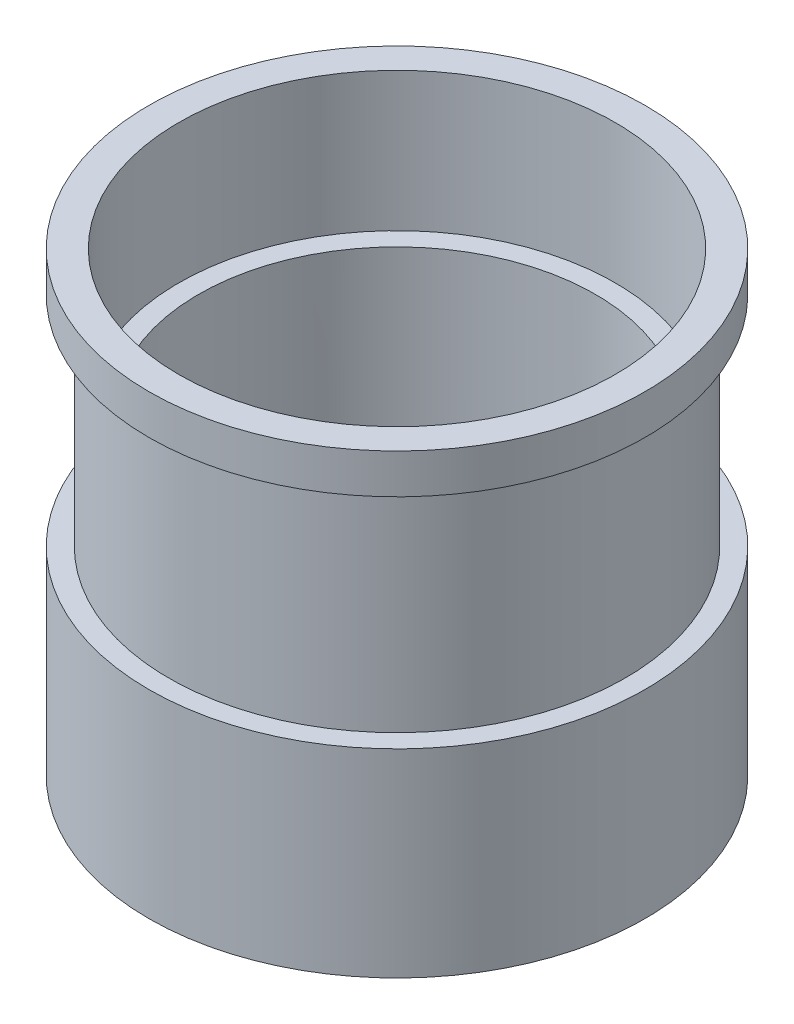
ISO-10303-21;
HEADER;
FILE_DESCRIPTION(('STEP AP214'),'2;1');
FILE_NAME('part.step','',(''),(''),'','','');
FILE_SCHEMA(('AUTOMOTIVE_DESIGN { 1 0 10303 214 1 1 1 1 }'));
ENDSEC;
DATA;
#1=APPLICATION_CONTEXT('core data for automotive mechanical design processes');
#2=APPLICATION_PROTOCOL_DEFINITION('international standard','automotive_design',2000,#1);
#3=PRODUCT_CONTEXT('',#1,'mechanical');
#4=PRODUCT('Part','Part','',(#3));
#5=PRODUCT_RELATED_PRODUCT_CATEGORY('part','',(#4));
#6=PRODUCT_DEFINITION_FORMATION('','',#4);
#7=PRODUCT_DEFINITION_CONTEXT('part definition',#1,'design');
#8=PRODUCT_DEFINITION('design','',#6,#7);
#9=PRODUCT_DEFINITION_SHAPE('','',#8);
#10=(LENGTH_UNIT() NAMED_UNIT(*) SI_UNIT(.MILLI.,.METRE.));
#11=(NAMED_UNIT(*) PLANE_ANGLE_UNIT() SI_UNIT($,.RADIAN.));
#12=(NAMED_UNIT(*) SI_UNIT($,.STERADIAN.) SOLID_ANGLE_UNIT());
#13=UNCERTAINTY_MEASURE_WITH_UNIT(LENGTH_MEASURE(1.E-05),#10,'distance_accuracy_value','');
#14=(GEOMETRIC_REPRESENTATION_CONTEXT(3) GLOBAL_UNCERTAINTY_ASSIGNED_CONTEXT((#13)) GLOBAL_UNIT_ASSIGNED_CONTEXT((#10,
#11,#12)) REPRESENTATION_CONTEXT('',''));
#15=CARTESIAN_POINT('',(0.,0.,0.));
#16=DIRECTION('',(0.,0.,1.));
#17=DIRECTION('',(1.,0.,0.));
#18=AXIS2_PLACEMENT_3D('',#15,#16,#17);
#19=CARTESIAN_POINT('',(0.,11.5,0.));
#20=DIRECTION('',(0.,-1.,0.));
#21=DIRECTION('',(0.,0.,-1.));
#22=AXIS2_PLACEMENT_3D('',#19,#20,#21);
#23=CYLINDRICAL_SURFACE('',#22,12.5);
#24=CARTESIAN_POINT('',(0.,-1.5,0.));
#25=DIRECTION('',(0.,-1.,0.));
#26=DIRECTION('',(0.,0.,-1.));
#27=AXIS2_PLACEMENT_3D('',#24,#25,#26);
#28=CIRCLE('',#27,12.5);
#29=CARTESIAN_POINT('',(0.,-1.5,-12.5));
#30=VERTEX_POINT('',#29);
#31=EDGE_CURVE('E69',#30,#30,#28,.T.);
#32=ORIENTED_EDGE('',*,*,#31,.T.);
#33=EDGE_LOOP('',(#32));
#34=FACE_BOUND('',#33,.T.);
#35=CARTESIAN_POINT('',(0.,-11.5,0.));
#36=DIRECTION('',(0.,1.,0.));
#37=DIRECTION('',(0.,0.,1.));
#38=AXIS2_PLACEMENT_3D('',#35,#36,#37);
#39=CIRCLE('',#38,12.5);
#40=CARTESIAN_POINT('',(0.,-11.5,12.5));
#41=VERTEX_POINT('',#40);
#42=EDGE_CURVE('E44',#41,#41,#39,.T.);
#43=ORIENTED_EDGE('',*,*,#42,.T.);
#44=EDGE_LOOP('',(#43));
#45=FACE_BOUND('',#44,.T.);
#46=ADVANCED_FACE('F36',(#34,#45),#23,.T.);
#47=CARTESIAN_POINT('',(0.,-11.5,0.));
#48=DIRECTION('',(0.,1.,0.));
#49=DIRECTION('',(0.,0.,1.));
#50=AXIS2_PLACEMENT_3D('',#47,#48,#49);
#51=CYLINDRICAL_SURFACE('',#50,10.);
#52=CARTESIAN_POINT('',(0.,4.5,0.));
#53=DIRECTION('',(0.,1.,0.));
#54=DIRECTION('',(0.,0.,1.));
#55=AXIS2_PLACEMENT_3D('',#52,#53,#54);
#56=CIRCLE('',#55,10.);
#57=CARTESIAN_POINT('',(0.,4.5,10.));
#58=VERTEX_POINT('',#57);
#59=EDGE_CURVE('E54',#58,#58,#56,.T.);
#60=ORIENTED_EDGE('',*,*,#59,.T.);
#61=EDGE_LOOP('',(#60));
#62=FACE_BOUND('',#61,.T.);
#63=CARTESIAN_POINT('',(0.,-4.5,0.));
#64=DIRECTION('',(0.,-1.,0.));
#65=DIRECTION('',(0.,0.,-1.));
#66=AXIS2_PLACEMENT_3D('',#63,#64,#65);
#67=CIRCLE('',#66,10.);
#68=CARTESIAN_POINT('',(0.,-4.5,-10.));
#69=VERTEX_POINT('',#68);
#70=EDGE_CURVE('E40',#69,#69,#67,.F.);
#71=ORIENTED_EDGE('',*,*,#70,.F.);
#72=EDGE_LOOP('',(#71));
#73=FACE_BOUND('',#72,.T.);
#74=ADVANCED_FACE('F93',(#62,#73),#51,.F.);
#75=CARTESIAN_POINT('',(0.,9.5,0.));
#76=DIRECTION('',(0.,-1.,0.));
#77=DIRECTION('',(0.,0.,-1.));
#78=AXIS2_PLACEMENT_3D('',#75,#76,#77);
#79=CIRCLE('',#78,12.5);
#80=CARTESIAN_POINT('',(0.,9.5,-12.5));
#81=VERTEX_POINT('',#80);
#82=EDGE_CURVE('E113',#81,#81,#79,.T.);
#83=ORIENTED_EDGE('',*,*,#82,.F.);
#84=EDGE_LOOP('',(#83));
#85=FACE_BOUND('',#84,.T.);
#86=CARTESIAN_POINT('',(0.,11.5,0.));
#87=DIRECTION('',(0.,1.,0.));
#88=DIRECTION('',(0.,0.,1.));
#89=AXIS2_PLACEMENT_3D('',#86,#87,#88);
#90=CIRCLE('',#89,12.5);
#91=CARTESIAN_POINT('',(0.,11.5,12.5));
#92=VERTEX_POINT('',#91);
#93=EDGE_CURVE('E10',#92,#92,#90,.T.);
#94=ORIENTED_EDGE('',*,*,#93,.F.);
#95=EDGE_LOOP('',(#94));
#96=FACE_BOUND('',#95,.T.);
#97=ADVANCED_FACE('F38',(#85,#96),#23,.T.);
#98=CARTESIAN_POINT('',(0.,11.5,0.));
#99=DIRECTION('',(0.,1.,0.));
#100=DIRECTION('',(0.,0.,1.));
#101=AXIS2_PLACEMENT_3D('',#98,#99,#100);
#102=PLANE('',#101);
#103=CARTESIAN_POINT('',(0.,11.5,0.));
#104=DIRECTION('',(0.,1.,0.));
#105=DIRECTION('',(0.,0.,1.));
#106=AXIS2_PLACEMENT_3D('',#103,#104,#105);
#107=CIRCLE('',#106,11.);
#108=CARTESIAN_POINT('',(0.,11.5,11.));
#109=VERTEX_POINT('',#108);
#110=EDGE_CURVE('E52',#109,#109,#107,.T.);
#111=ORIENTED_EDGE('',*,*,#110,.F.);
#112=EDGE_LOOP('',(#111));
#113=FACE_BOUND('',#112,.T.);
#114=ORIENTED_EDGE('',*,*,#93,.T.);
#115=EDGE_LOOP('',(#114));
#116=FACE_BOUND('',#115,.T.);
#117=ADVANCED_FACE('F85',(#113,#116),#102,.T.);
#118=CARTESIAN_POINT('',(0.,-11.5,0.));
#119=DIRECTION('',(0.,1.,0.));
#120=DIRECTION('',(0.,0.,1.));
#121=AXIS2_PLACEMENT_3D('',#118,#119,#120);
#122=PLANE('',#121);
#123=CARTESIAN_POINT('',(0.,-11.5,0.));
#124=DIRECTION('',(0.,1.,0.));
#125=DIRECTION('',(0.,0.,1.));
#126=AXIS2_PLACEMENT_3D('',#123,#124,#125);
#127=CIRCLE('',#126,11.);
#128=CARTESIAN_POINT('',(0.,-11.5,11.));
#129=VERTEX_POINT('',#128);
#130=EDGE_CURVE('E64',#129,#129,#127,.T.);
#131=ORIENTED_EDGE('',*,*,#130,.T.);
#132=EDGE_LOOP('',(#131));
#133=FACE_BOUND('',#132,.T.);
#134=ORIENTED_EDGE('',*,*,#42,.F.);
#135=EDGE_LOOP('',(#134));
#136=FACE_BOUND('',#135,.T.);
#137=ADVANCED_FACE('F81',(#133,#136),#122,.F.);
#138=CARTESIAN_POINT('',(0.,4.5,0.));
#139=DIRECTION('',(0.,1.,0.));
#140=DIRECTION('',(0.,0.,1.));
#141=AXIS2_PLACEMENT_3D('',#138,#139,#140);
#142=CYLINDRICAL_SURFACE('',#141,11.);
#143=CARTESIAN_POINT('',(0.,4.5,0.));
#144=DIRECTION('',(0.,1.,0.));
#145=DIRECTION('',(0.,0.,1.));
#146=AXIS2_PLACEMENT_3D('',#143,#144,#145);
#147=CIRCLE('',#146,11.);
#148=CARTESIAN_POINT('',(0.,4.5,11.));
#149=VERTEX_POINT('',#148);
#150=EDGE_CURVE('E49',#149,#149,#147,.T.);
#151=ORIENTED_EDGE('',*,*,#150,.F.);
#152=EDGE_LOOP('',(#151));
#153=FACE_BOUND('',#152,.T.);
#154=ORIENTED_EDGE('',*,*,#110,.T.);
#155=EDGE_LOOP('',(#154));
#156=FACE_BOUND('',#155,.T.);
#157=ADVANCED_FACE('F78',(#153,#156),#142,.F.);
#158=CARTESIAN_POINT('',(0.,4.5,0.));
#159=DIRECTION('',(0.,1.,0.));
#160=DIRECTION('',(0.,0.,1.));
#161=AXIS2_PLACEMENT_3D('',#158,#159,#160);
#162=PLANE('',#161);
#163=ORIENTED_EDGE('',*,*,#59,.F.);
#164=EDGE_LOOP('',(#163));
#165=FACE_BOUND('',#164,.T.);
#166=ORIENTED_EDGE('',*,*,#150,.T.);
#167=EDGE_LOOP('',(#166));
#168=FACE_BOUND('',#167,.T.);
#169=ADVANCED_FACE('F76',(#165,#168),#162,.T.);
#170=CARTESIAN_POINT('',(0.,-4.5,0.));
#171=DIRECTION('',(0.,-1.,0.));
#172=DIRECTION('',(0.,0.,1.));
#173=AXIS2_PLACEMENT_3D('',#170,#171,#172);
#174=PLANE('',#173);
#175=CARTESIAN_POINT('',(0.,-4.5,0.));
#176=DIRECTION('',(0.,1.,0.));
#177=DIRECTION('',(0.,0.,1.));
#178=AXIS2_PLACEMENT_3D('',#175,#176,#177);
#179=CIRCLE('',#178,11.);
#180=CARTESIAN_POINT('',(0.,-4.5,11.));
#181=VERTEX_POINT('',#180);
#182=EDGE_CURVE('E60',#181,#181,#179,.T.);
#183=ORIENTED_EDGE('',*,*,#182,.F.);
#184=EDGE_LOOP('',(#183));
#185=FACE_BOUND('',#184,.T.);
#186=ORIENTED_EDGE('',*,*,#70,.T.);
#187=EDGE_LOOP('',(#186));
#188=FACE_BOUND('',#187,.T.);
#189=ADVANCED_FACE('F136',(#185,#188),#174,.T.);
#190=CARTESIAN_POINT('',(0.,-4.5,0.));
#191=DIRECTION('',(0.,-1.,0.));
#192=DIRECTION('',(0.,0.,-1.));
#193=AXIS2_PLACEMENT_3D('',#190,#191,#192);
#194=CYLINDRICAL_SURFACE('',#193,11.);
#195=ORIENTED_EDGE('',*,*,#182,.T.);
#196=EDGE_LOOP('',(#195));
#197=FACE_BOUND('',#196,.T.);
#198=ORIENTED_EDGE('',*,*,#130,.F.);
#199=EDGE_LOOP('',(#198));
#200=FACE_BOUND('',#199,.T.);
#201=ADVANCED_FACE('F135',(#197,#200),#194,.F.);
#202=CARTESIAN_POINT('',(12.5,-1.5,0.));
#203=DIRECTION('',(0.,-1.,0.));
#204=DIRECTION('',(0.,0.,-1.));
#205=AXIS2_PLACEMENT_3D('',#202,#203,#204);
#206=PLANE('',#205);
#207=ORIENTED_EDGE('',*,*,#31,.F.);
#208=EDGE_LOOP('',(#207));
#209=FACE_BOUND('',#208,.T.);
#210=CARTESIAN_POINT('',(0.,-1.5,0.));
#211=DIRECTION('',(0.,-1.,0.));
#212=DIRECTION('',(0.,0.,-1.));
#213=AXIS2_PLACEMENT_3D('',#210,#211,#212);
#214=CIRCLE('',#213,11.5);
#215=CARTESIAN_POINT('',(0.,-1.5,-11.5));
#216=VERTEX_POINT('',#215);
#217=EDGE_CURVE('E107',#216,#216,#214,.T.);
#218=ORIENTED_EDGE('',*,*,#217,.T.);
#219=EDGE_LOOP('',(#218));
#220=FACE_BOUND('',#219,.T.);
#221=ADVANCED_FACE('F128',(#209,#220),#206,.F.);
#222=CARTESIAN_POINT('',(0.,-12.65,0.));
#223=DIRECTION('',(0.,-1.,0.));
#224=DIRECTION('',(0.,0.,-1.));
#225=AXIS2_PLACEMENT_3D('',#222,#223,#224);
#226=CYLINDRICAL_SURFACE('',#225,11.5);
#227=ORIENTED_EDGE('',*,*,#217,.F.);
#228=EDGE_LOOP('',(#227));
#229=FACE_BOUND('',#228,.T.);
#230=CARTESIAN_POINT('',(0.,9.5,0.));
#231=DIRECTION('',(0.,-1.,0.));
#232=DIRECTION('',(0.,0.,-1.));
#233=AXIS2_PLACEMENT_3D('',#230,#231,#232);
#234=CIRCLE('',#233,11.5);
#235=CARTESIAN_POINT('',(0.,9.5,-11.5));
#236=VERTEX_POINT('',#235);
#237=EDGE_CURVE('E109',#236,#236,#234,.T.);
#238=ORIENTED_EDGE('',*,*,#237,.T.);
#239=EDGE_LOOP('',(#238));
#240=FACE_BOUND('',#239,.T.);
#241=ADVANCED_FACE('F122',(#229,#240),#226,.T.);
#242=CARTESIAN_POINT('',(12.5,9.5,0.));
#243=DIRECTION('',(0.,1.,0.));
#244=DIRECTION('',(0.,0.,1.));
#245=AXIS2_PLACEMENT_3D('',#242,#243,#244);
#246=PLANE('',#245);
#247=ORIENTED_EDGE('',*,*,#237,.F.);
#248=EDGE_LOOP('',(#247));
#249=FACE_BOUND('',#248,.T.);
#250=ORIENTED_EDGE('',*,*,#82,.T.);
#251=EDGE_LOOP('',(#250));
#252=FACE_BOUND('',#251,.T.);
#253=ADVANCED_FACE('F119',(#249,#252),#246,.F.);
#254=CLOSED_SHELL('',(#46,#74,#97,#117,#137,#157,#169,#189,#201,#221,#241,#253));
#255=MANIFOLD_SOLID_BREP('B2',#254);
#256=ADVANCED_BREP_SHAPE_REPRESENTATION('',(#18,#255),#14);
#257=SHAPE_DEFINITION_REPRESENTATION(#9,#256);
ENDSEC;
END-ISO-10303-21;
